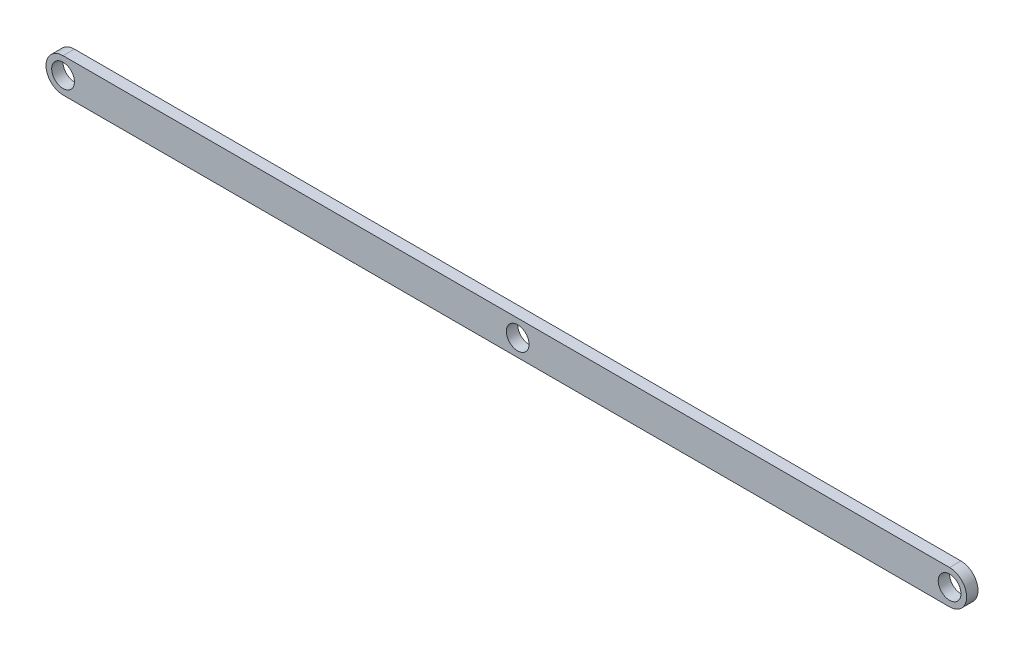
ISO-10303-21;
HEADER;
FILE_DESCRIPTION(('STEP AP214'),'2;1');
FILE_NAME('part.step','',(''),(''),'','','');
FILE_SCHEMA(('AUTOMOTIVE_DESIGN { 1 0 10303 214 1 1 1 1 }'));
ENDSEC;
DATA;
#1=APPLICATION_CONTEXT('core data for automotive mechanical design processes');
#2=APPLICATION_PROTOCOL_DEFINITION('international standard','automotive_design',2000,#1);
#3=PRODUCT_CONTEXT('',#1,'mechanical');
#4=PRODUCT('Part','Part','',(#3));
#5=PRODUCT_RELATED_PRODUCT_CATEGORY('part','',(#4));
#6=PRODUCT_DEFINITION_FORMATION('','',#4);
#7=PRODUCT_DEFINITION_CONTEXT('part definition',#1,'design');
#8=PRODUCT_DEFINITION('design','',#6,#7);
#9=PRODUCT_DEFINITION_SHAPE('','',#8);
#10=(LENGTH_UNIT() NAMED_UNIT(*) SI_UNIT(.MILLI.,.METRE.));
#11=(NAMED_UNIT(*) PLANE_ANGLE_UNIT() SI_UNIT($,.RADIAN.));
#12=(NAMED_UNIT(*) SI_UNIT($,.STERADIAN.) SOLID_ANGLE_UNIT());
#13=UNCERTAINTY_MEASURE_WITH_UNIT(LENGTH_MEASURE(1.E-05),#10,'distance_accuracy_value','');
#14=(GEOMETRIC_REPRESENTATION_CONTEXT(3) GLOBAL_UNCERTAINTY_ASSIGNED_CONTEXT((#13)) GLOBAL_UNIT_ASSIGNED_CONTEXT((#10,
#11,#12)) REPRESENTATION_CONTEXT('',''));
#15=CARTESIAN_POINT('',(0.,0.,0.));
#16=DIRECTION('',(0.,0.,1.));
#17=DIRECTION('',(1.,0.,0.));
#18=AXIS2_PLACEMENT_3D('',#15,#16,#17);
#19=CARTESIAN_POINT('',(0.,0.,10.));
#20=DIRECTION('',(0.,0.,1.));
#21=DIRECTION('',(1.,0.,0.));
#22=AXIS2_PLACEMENT_3D('',#19,#20,#21);
#23=PLANE('',#22);
#24=CARTESIAN_POINT('',(780.,0.,10.));
#25=DIRECTION('',(0.,0.,1.));
#26=DIRECTION('',(1.,0.,0.));
#27=AXIS2_PLACEMENT_3D('',#24,#25,#26);
#28=CIRCLE('',#27,9.99999999999998);
#29=CARTESIAN_POINT('',(790.,0.,10.));
#30=VERTEX_POINT('',#29);
#31=EDGE_CURVE('E140',#30,#30,#28,.T.);
#32=ORIENTED_EDGE('',*,*,#31,.F.);
#33=EDGE_LOOP('',(#32));
#34=FACE_BOUND('',#33,.T.);
#35=CARTESIAN_POINT('',(0.,0.,10.));
#36=DIRECTION('',(0.,0.,1.));
#37=DIRECTION('',(1.,0.,0.));
#38=AXIS2_PLACEMENT_3D('',#35,#36,#37);
#39=CIRCLE('',#38,15.);
#40=CARTESIAN_POINT('',(0.,15.,10.));
#41=VERTEX_POINT('',#40);
#42=CARTESIAN_POINT('',(0.,-15.,10.));
#43=VERTEX_POINT('',#42);
#44=EDGE_CURVE('E98',#41,#43,#39,.T.);
#45=ORIENTED_EDGE('',*,*,#44,.T.);
#46=DIRECTION('',(1.,0.,0.));
#47=VECTOR('',#46,1.);
#48=CARTESIAN_POINT('',(0.,-15.,10.));
#49=LINE('',#48,#47);
#50=CARTESIAN_POINT('',(780.,-15.,10.));
#51=VERTEX_POINT('',#50);
#52=EDGE_CURVE('E93',#43,#51,#49,.T.);
#53=ORIENTED_EDGE('',*,*,#52,.T.);
#54=CARTESIAN_POINT('',(780.,0.,10.));
#55=DIRECTION('',(0.,0.,1.));
#56=DIRECTION('',(1.,0.,0.));
#57=AXIS2_PLACEMENT_3D('',#54,#55,#56);
#58=CIRCLE('',#57,15.);
#59=CARTESIAN_POINT('',(780.,15.,10.));
#60=VERTEX_POINT('',#59);
#61=EDGE_CURVE('E96',#51,#60,#58,.T.);
#62=ORIENTED_EDGE('',*,*,#61,.T.);
#63=DIRECTION('',(-1.,0.,0.));
#64=VECTOR('',#63,1.);
#65=CARTESIAN_POINT('',(0.,15.,10.));
#66=LINE('',#65,#64);
#67=EDGE_CURVE('E63',#60,#41,#66,.T.);
#68=ORIENTED_EDGE('',*,*,#67,.T.);
#69=EDGE_LOOP('',(#45,#53,#62,#68));
#70=FACE_BOUND('',#69,.T.);
#71=CARTESIAN_POINT('',(0.,0.,10.));
#72=DIRECTION('',(0.,0.,1.));
#73=DIRECTION('',(1.,0.,0.));
#74=AXIS2_PLACEMENT_3D('',#71,#72,#73);
#75=CIRCLE('',#74,10.);
#76=CARTESIAN_POINT('',(10.,0.,10.));
#77=VERTEX_POINT('',#76);
#78=EDGE_CURVE('E118',#77,#77,#75,.T.);
#79=ORIENTED_EDGE('',*,*,#78,.F.);
#80=EDGE_LOOP('',(#79));
#81=FACE_BOUND('',#80,.T.);
#82=CARTESIAN_POINT('',(400.,0.,10.));
#83=DIRECTION('',(0.,0.,1.));
#84=DIRECTION('',(1.,0.,0.));
#85=AXIS2_PLACEMENT_3D('',#82,#83,#84);
#86=CIRCLE('',#85,9.99999999999998);
#87=CARTESIAN_POINT('',(410.,0.,10.));
#88=VERTEX_POINT('',#87);
#89=EDGE_CURVE('E148',#88,#88,#86,.T.);
#90=ORIENTED_EDGE('',*,*,#89,.F.);
#91=EDGE_LOOP('',(#90));
#92=FACE_BOUND('',#91,.T.);
#93=ADVANCED_FACE('F45',(#34,#70,#81,#92),#23,.T.);
#94=CARTESIAN_POINT('',(0.,0.,0.));
#95=DIRECTION('',(0.,0.,1.));
#96=DIRECTION('',(1.,0.,0.));
#97=AXIS2_PLACEMENT_3D('',#94,#95,#96);
#98=PLANE('',#97);
#99=CARTESIAN_POINT('',(0.,0.,0.));
#100=DIRECTION('',(0.,0.,1.));
#101=DIRECTION('',(1.,0.,0.));
#102=AXIS2_PLACEMENT_3D('',#99,#100,#101);
#103=CIRCLE('',#102,15.);
#104=CARTESIAN_POINT('',(0.,15.,0.));
#105=VERTEX_POINT('',#104);
#106=CARTESIAN_POINT('',(0.,-15.,0.));
#107=VERTEX_POINT('',#106);
#108=EDGE_CURVE('E114',#105,#107,#103,.T.);
#109=ORIENTED_EDGE('',*,*,#108,.F.);
#110=DIRECTION('',(-1.,0.,0.));
#111=VECTOR('',#110,1.);
#112=CARTESIAN_POINT('',(0.,15.,0.));
#113=LINE('',#112,#111);
#114=CARTESIAN_POINT('',(780.,15.,0.));
#115=VERTEX_POINT('',#114);
#116=EDGE_CURVE('E86',#115,#105,#113,.T.);
#117=ORIENTED_EDGE('',*,*,#116,.F.);
#118=CARTESIAN_POINT('',(780.,0.,0.));
#119=DIRECTION('',(0.,0.,1.));
#120=DIRECTION('',(1.,0.,0.));
#121=AXIS2_PLACEMENT_3D('',#118,#119,#120);
#122=CIRCLE('',#121,15.);
#123=CARTESIAN_POINT('',(780.,-15.,0.));
#124=VERTEX_POINT('',#123);
#125=EDGE_CURVE('E80',#124,#115,#122,.T.);
#126=ORIENTED_EDGE('',*,*,#125,.F.);
#127=DIRECTION('',(1.,0.,0.));
#128=VECTOR('',#127,1.);
#129=CARTESIAN_POINT('',(0.,-15.,0.));
#130=LINE('',#129,#128);
#131=EDGE_CURVE('E103',#107,#124,#130,.T.);
#132=ORIENTED_EDGE('',*,*,#131,.F.);
#133=EDGE_LOOP('',(#109,#117,#126,#132));
#134=FACE_BOUND('',#133,.T.);
#135=CARTESIAN_POINT('',(0.,0.,0.));
#136=DIRECTION('',(0.,0.,1.));
#137=DIRECTION('',(1.,0.,0.));
#138=AXIS2_PLACEMENT_3D('',#135,#136,#137);
#139=CIRCLE('',#138,10.);
#140=CARTESIAN_POINT('',(10.,0.,0.));
#141=VERTEX_POINT('',#140);
#142=EDGE_CURVE('E136',#141,#141,#139,.T.);
#143=ORIENTED_EDGE('',*,*,#142,.T.);
#144=EDGE_LOOP('',(#143));
#145=FACE_BOUND('',#144,.T.);
#146=CARTESIAN_POINT('',(780.,0.,0.));
#147=DIRECTION('',(0.,0.,1.));
#148=DIRECTION('',(1.,0.,0.));
#149=AXIS2_PLACEMENT_3D('',#146,#147,#148);
#150=CIRCLE('',#149,9.99999999999998);
#151=CARTESIAN_POINT('',(790.,0.,0.));
#152=VERTEX_POINT('',#151);
#153=EDGE_CURVE('E144',#152,#152,#150,.T.);
#154=ORIENTED_EDGE('',*,*,#153,.T.);
#155=EDGE_LOOP('',(#154));
#156=FACE_BOUND('',#155,.T.);
#157=CARTESIAN_POINT('',(400.,0.,0.));
#158=DIRECTION('',(0.,0.,1.));
#159=DIRECTION('',(1.,0.,0.));
#160=AXIS2_PLACEMENT_3D('',#157,#158,#159);
#161=CIRCLE('',#160,9.99999999999998);
#162=CARTESIAN_POINT('',(410.,0.,0.));
#163=VERTEX_POINT('',#162);
#164=EDGE_CURVE('E152',#163,#163,#161,.T.);
#165=ORIENTED_EDGE('',*,*,#164,.T.);
#166=EDGE_LOOP('',(#165));
#167=FACE_BOUND('',#166,.T.);
#168=ADVANCED_FACE('F131',(#134,#145,#156,#167),#98,.F.);
#169=CARTESIAN_POINT('',(0.,0.,10.));
#170=DIRECTION('',(0.,0.,-1.));
#171=DIRECTION('',(-1.,0.,0.));
#172=AXIS2_PLACEMENT_3D('',#169,#170,#171);
#173=CYLINDRICAL_SURFACE('',#172,15.);
#174=ORIENTED_EDGE('',*,*,#108,.T.);
#175=DIRECTION('',(0.,0.,-1.));
#176=VECTOR('',#175,1.);
#177=CARTESIAN_POINT('',(0.,-15.,10.));
#178=LINE('',#177,#176);
#179=EDGE_CURVE('E11',#43,#107,#178,.T.);
#180=ORIENTED_EDGE('',*,*,#179,.F.);
#181=ORIENTED_EDGE('',*,*,#44,.F.);
#182=DIRECTION('',(0.,0.,-1.));
#183=VECTOR('',#182,1.);
#184=CARTESIAN_POINT('',(0.,15.,10.));
#185=LINE('',#184,#183);
#186=EDGE_CURVE('E110',#41,#105,#185,.T.);
#187=ORIENTED_EDGE('',*,*,#186,.T.);
#188=EDGE_LOOP('',(#174,#180,#181,#187));
#189=FACE_BOUND('',#188,.T.);
#190=ADVANCED_FACE('F47',(#189),#173,.T.);
#191=CARTESIAN_POINT('',(0.,-15.,10.));
#192=DIRECTION('',(0.,1.,0.));
#193=DIRECTION('',(0.,0.,1.));
#194=AXIS2_PLACEMENT_3D('',#191,#192,#193);
#195=PLANE('',#194);
#196=ORIENTED_EDGE('',*,*,#131,.T.);
#197=DIRECTION('',(0.,0.,-1.));
#198=VECTOR('',#197,1.);
#199=CARTESIAN_POINT('',(780.,-15.,10.));
#200=LINE('',#199,#198);
#201=EDGE_CURVE('E55',#51,#124,#200,.T.);
#202=ORIENTED_EDGE('',*,*,#201,.F.);
#203=ORIENTED_EDGE('',*,*,#52,.F.);
#204=ORIENTED_EDGE('',*,*,#179,.T.);
#205=EDGE_LOOP('',(#196,#202,#203,#204));
#206=FACE_BOUND('',#205,.T.);
#207=ADVANCED_FACE('F102',(#206),#195,.F.);
#208=CARTESIAN_POINT('',(780.,0.,10.));
#209=DIRECTION('',(0.,0.,-1.));
#210=DIRECTION('',(-1.,0.,0.));
#211=AXIS2_PLACEMENT_3D('',#208,#209,#210);
#212=CYLINDRICAL_SURFACE('',#211,15.);
#213=ORIENTED_EDGE('',*,*,#125,.T.);
#214=DIRECTION('',(0.,0.,-1.));
#215=VECTOR('',#214,1.);
#216=CARTESIAN_POINT('',(780.,15.,10.));
#217=LINE('',#216,#215);
#218=EDGE_CURVE('E105',#60,#115,#217,.T.);
#219=ORIENTED_EDGE('',*,*,#218,.F.);
#220=ORIENTED_EDGE('',*,*,#61,.F.);
#221=ORIENTED_EDGE('',*,*,#201,.T.);
#222=EDGE_LOOP('',(#213,#219,#220,#221));
#223=FACE_BOUND('',#222,.T.);
#224=ADVANCED_FACE('F106',(#223),#212,.T.);
#225=CARTESIAN_POINT('',(0.,15.,10.));
#226=DIRECTION('',(0.,-1.,0.));
#227=DIRECTION('',(0.,0.,-1.));
#228=AXIS2_PLACEMENT_3D('',#225,#226,#227);
#229=PLANE('',#228);
#230=ORIENTED_EDGE('',*,*,#116,.T.);
#231=ORIENTED_EDGE('',*,*,#186,.F.);
#232=ORIENTED_EDGE('',*,*,#67,.F.);
#233=ORIENTED_EDGE('',*,*,#218,.T.);
#234=EDGE_LOOP('',(#230,#231,#232,#233));
#235=FACE_BOUND('',#234,.T.);
#236=ADVANCED_FACE('F128',(#235),#229,.F.);
#237=CARTESIAN_POINT('',(0.,0.,10.));
#238=DIRECTION('',(0.,0.,-1.));
#239=DIRECTION('',(-1.,0.,0.));
#240=AXIS2_PLACEMENT_3D('',#237,#238,#239);
#241=CYLINDRICAL_SURFACE('',#240,10.);
#242=ORIENTED_EDGE('',*,*,#78,.T.);
#243=EDGE_LOOP('',(#242));
#244=FACE_BOUND('',#243,.T.);
#245=ORIENTED_EDGE('',*,*,#142,.F.);
#246=EDGE_LOOP('',(#245));
#247=FACE_BOUND('',#246,.T.);
#248=ADVANCED_FACE('F172',(#244,#247),#241,.F.);
#249=CARTESIAN_POINT('',(780.,0.,10.));
#250=DIRECTION('',(0.,0.,-1.));
#251=DIRECTION('',(-1.,0.,0.));
#252=AXIS2_PLACEMENT_3D('',#249,#250,#251);
#253=CYLINDRICAL_SURFACE('',#252,9.99999999999998);
#254=ORIENTED_EDGE('',*,*,#31,.T.);
#255=EDGE_LOOP('',(#254));
#256=FACE_BOUND('',#255,.T.);
#257=ORIENTED_EDGE('',*,*,#153,.F.);
#258=EDGE_LOOP('',(#257));
#259=FACE_BOUND('',#258,.T.);
#260=ADVANCED_FACE('F217',(#256,#259),#253,.F.);
#261=CARTESIAN_POINT('',(400.,0.,10.));
#262=DIRECTION('',(0.,0.,-1.));
#263=DIRECTION('',(-1.,0.,0.));
#264=AXIS2_PLACEMENT_3D('',#261,#262,#263);
#265=CYLINDRICAL_SURFACE('',#264,9.99999999999998);
#266=ORIENTED_EDGE('',*,*,#89,.T.);
#267=EDGE_LOOP('',(#266));
#268=FACE_BOUND('',#267,.T.);
#269=ORIENTED_EDGE('',*,*,#164,.F.);
#270=EDGE_LOOP('',(#269));
#271=FACE_BOUND('',#270,.T.);
#272=ADVANCED_FACE('F160',(#268,#271),#265,.F.);
#273=CLOSED_SHELL('',(#93,#168,#190,#207,#224,#236,#248,#260,#272));
#274=MANIFOLD_SOLID_BREP('B2',#273);
#275=ADVANCED_BREP_SHAPE_REPRESENTATION('',(#18,#274),#14);
#276=SHAPE_DEFINITION_REPRESENTATION(#9,#275);
ENDSEC;
END-ISO-10303-21;
